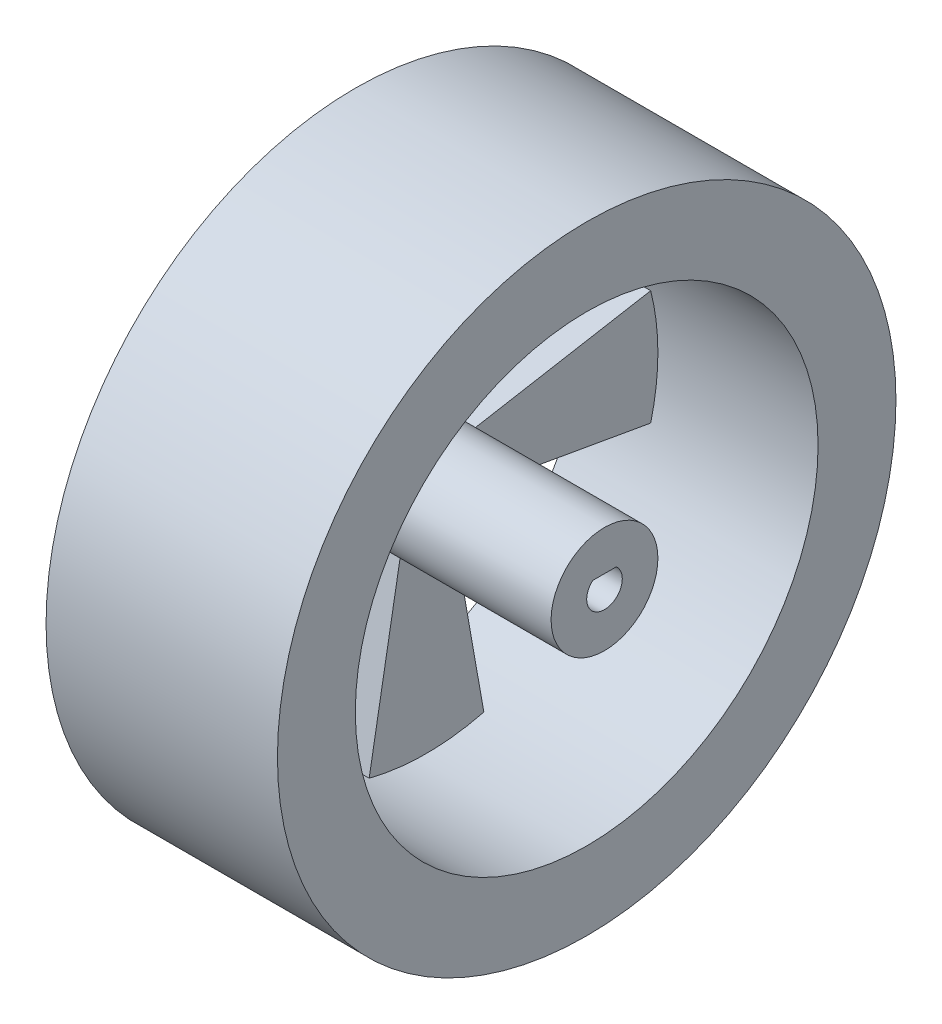
ISO-10303-21;
HEADER;
FILE_DESCRIPTION(('STEP AP214'),'2;1');
FILE_NAME('part.step','',(''),(''),'','','');
FILE_SCHEMA(('AUTOMOTIVE_DESIGN { 1 0 10303 214 1 1 1 1 }'));
ENDSEC;
DATA;
#1=APPLICATION_CONTEXT('core data for automotive mechanical design processes');
#2=APPLICATION_PROTOCOL_DEFINITION('international standard','automotive_design',2000,#1);
#3=PRODUCT_CONTEXT('',#1,'mechanical');
#4=PRODUCT('Part','Part','',(#3));
#5=PRODUCT_RELATED_PRODUCT_CATEGORY('part','',(#4));
#6=PRODUCT_DEFINITION_FORMATION('','',#4);
#7=PRODUCT_DEFINITION_CONTEXT('part definition',#1,'design');
#8=PRODUCT_DEFINITION('design','',#6,#7);
#9=PRODUCT_DEFINITION_SHAPE('','',#8);
#10=(LENGTH_UNIT() NAMED_UNIT(*) SI_UNIT(.MILLI.,.METRE.));
#11=(NAMED_UNIT(*) PLANE_ANGLE_UNIT() SI_UNIT($,.RADIAN.));
#12=(NAMED_UNIT(*) SI_UNIT($,.STERADIAN.) SOLID_ANGLE_UNIT());
#13=UNCERTAINTY_MEASURE_WITH_UNIT(LENGTH_MEASURE(1.E-05),#10,'distance_accuracy_value','');
#14=(GEOMETRIC_REPRESENTATION_CONTEXT(3) GLOBAL_UNCERTAINTY_ASSIGNED_CONTEXT((#13)) GLOBAL_UNIT_ASSIGNED_CONTEXT((#10,
#11,#12)) REPRESENTATION_CONTEXT('',''));
#15=CARTESIAN_POINT('',(0.,0.,0.));
#16=DIRECTION('',(0.,0.,1.));
#17=DIRECTION('',(1.,0.,0.));
#18=AXIS2_PLACEMENT_3D('',#15,#16,#17);
#19=CARTESIAN_POINT('',(8.,0.,0.));
#20=DIRECTION('',(1.,0.,0.));
#21=DIRECTION('',(0.,0.,-1.));
#22=AXIS2_PLACEMENT_3D('',#19,#20,#21);
#23=PLANE('',#22);
#24=DIRECTION('',(0.,0.984807753012209,0.173648177666926));
#25=VECTOR('',#24,1.);
#26=CARTESIAN_POINT('',(8.,-2.42814800674033,-2.42814800674181));
#27=LINE('',#26,#25);
#28=CARTESIAN_POINT('',(8.,-25.1894055583955,-6.44157182795281));
#29=VERTEX_POINT('',#28);
#30=CARTESIAN_POINT('',(8.,-5.23938288019943,-2.92384456404118));
#31=VERTEX_POINT('',#30);
#32=EDGE_CURVE('E242',#29,#31,#27,.T.);
#33=ORIENTED_EDGE('',*,*,#32,.T.);
#34=CARTESIAN_POINT('',(8.,0.,0.));
#35=DIRECTION('',(1.,0.,0.));
#36=DIRECTION('',(0.,0.,-1.));
#37=AXIS2_PLACEMENT_3D('',#34,#35,#36);
#38=CIRCLE('',#37,6.);
#39=CARTESIAN_POINT('',(8.,-5.23938288020022,2.92384456403975));
#40=VERTEX_POINT('',#39);
#41=EDGE_CURVE('E11',#31,#40,#38,.F.);
#42=ORIENTED_EDGE('',*,*,#41,.T.);
#43=DIRECTION('',(0.,-0.984807753012199,0.173648177666982));
#44=VECTOR('',#43,1.);
#45=CARTESIAN_POINT('',(8.,-2.42814800674181,2.42814800674034));
#46=LINE('',#45,#44);
#47=CARTESIAN_POINT('',(8.,-25.1894055583956,6.44157182795243));
#48=VERTEX_POINT('',#47);
#49=EDGE_CURVE('E233',#40,#48,#46,.T.);
#50=ORIENTED_EDGE('',*,*,#49,.T.);
#51=CARTESIAN_POINT('',(8.,0.,0.));
#52=DIRECTION('',(1.,0.,0.));
#53=DIRECTION('',(0.,0.,-1.));
#54=AXIS2_PLACEMENT_3D('',#51,#52,#53);
#55=CIRCLE('',#54,26.);
#56=EDGE_CURVE('E237',#48,#29,#55,.T.);
#57=ORIENTED_EDGE('',*,*,#56,.T.);
#58=EDGE_LOOP('',(#33,#42,#50,#57));
#59=FACE_BOUND('',#58,.T.);
#60=ADVANCED_FACE('F40',(#59),#23,.T.);
#61=DIRECTION('',(0.,0.173648177666922,-0.98480775301221));
#62=VECTOR('',#61,1.);
#63=CARTESIAN_POINT('',(8.,-2.42814800674181,2.42814800674034));
#64=LINE('',#63,#62);
#65=CARTESIAN_POINT('',(8.,-6.44157182795271,25.1894055583955));
#66=VERTEX_POINT('',#65);
#67=CARTESIAN_POINT('',(8.,-2.92384456404117,5.23938288019943));
#68=VERTEX_POINT('',#67);
#69=EDGE_CURVE('E229',#66,#68,#64,.T.);
#70=ORIENTED_EDGE('',*,*,#69,.T.);
#71=CARTESIAN_POINT('',(8.,2.92384456403975,5.23938288020022));
#72=VERTEX_POINT('',#71);
#73=EDGE_CURVE('E50',#68,#72,#38,.F.);
#74=ORIENTED_EDGE('',*,*,#73,.T.);
#75=DIRECTION('',(0.,0.173648177666982,0.984807753012199));
#76=VECTOR('',#75,1.);
#77=CARTESIAN_POINT('',(8.,2.42814800674034,2.42814800674181));
#78=LINE('',#77,#76);
#79=CARTESIAN_POINT('',(8.,6.44157182795243,25.1894055583956));
#80=VERTEX_POINT('',#79);
#81=EDGE_CURVE('E220',#72,#80,#78,.T.);
#82=ORIENTED_EDGE('',*,*,#81,.T.);
#83=CARTESIAN_POINT('',(8.,0.,0.));
#84=DIRECTION('',(1.,0.,0.));
#85=DIRECTION('',(0.,0.,-1.));
#86=AXIS2_PLACEMENT_3D('',#83,#84,#85);
#87=CIRCLE('',#86,26.);
#88=EDGE_CURVE('E224',#80,#66,#87,.T.);
#89=ORIENTED_EDGE('',*,*,#88,.T.);
#90=EDGE_LOOP('',(#70,#74,#82,#89));
#91=FACE_BOUND('',#90,.T.);
#92=ADVANCED_FACE('F439',(#91),#23,.T.);
#93=DIRECTION('',(0.,-0.984807753012212,-0.17364817766691));
#94=VECTOR('',#93,1.);
#95=CARTESIAN_POINT('',(8.,2.42814800674034,2.42814800674181));
#96=LINE('',#95,#94);
#97=CARTESIAN_POINT('',(8.,25.1894055583956,6.44157182795243));
#98=VERTEX_POINT('',#97);
#99=CARTESIAN_POINT('',(8.,5.23938288019945,2.92384456404114));
#100=VERTEX_POINT('',#99);
#101=EDGE_CURVE('E216',#98,#100,#96,.T.);
#102=ORIENTED_EDGE('',*,*,#101,.T.);
#103=CARTESIAN_POINT('',(8.,5.23938288020019,-2.92384456403982));
#104=VERTEX_POINT('',#103);
#105=EDGE_CURVE('E451',#100,#104,#38,.F.);
#106=ORIENTED_EDGE('',*,*,#105,.T.);
#107=DIRECTION('',(0.,0.984807753012195,-0.173648177667007));
#108=VECTOR('',#107,1.);
#109=CARTESIAN_POINT('',(8.,2.42814800674181,-2.42814800674034));
#110=LINE('',#109,#108);
#111=CARTESIAN_POINT('',(8.,25.1894055583954,-6.44157182795298));
#112=VERTEX_POINT('',#111);
#113=EDGE_CURVE('E207',#104,#112,#110,.T.);
#114=ORIENTED_EDGE('',*,*,#113,.T.);
#115=CARTESIAN_POINT('',(8.,0.,0.));
#116=DIRECTION('',(1.,0.,0.));
#117=DIRECTION('',(0.,0.,-1.));
#118=AXIS2_PLACEMENT_3D('',#115,#116,#117);
#119=CIRCLE('',#118,26.);
#120=EDGE_CURVE('E211',#112,#98,#119,.T.);
#121=ORIENTED_EDGE('',*,*,#120,.T.);
#122=EDGE_LOOP('',(#102,#106,#114,#121));
#123=FACE_BOUND('',#122,.T.);
#124=ADVANCED_FACE('F368',(#123),#23,.T.);
#125=CARTESIAN_POINT('',(26.,0.,0.));
#126=DIRECTION('',(-1.,0.,0.));
#127=DIRECTION('',(0.,0.,1.));
#128=AXIS2_PLACEMENT_3D('',#125,#126,#127);
#129=CYLINDRICAL_SURFACE('',#128,26.);
#130=CARTESIAN_POINT('',(26.,0.,0.));
#131=DIRECTION('',(1.,0.,0.));
#132=DIRECTION('',(0.,0.,-1.));
#133=AXIS2_PLACEMENT_3D('',#130,#131,#132);
#134=CIRCLE('',#133,26.);
#135=CARTESIAN_POINT('',(26.,0.,-26.));
#136=VERTEX_POINT('',#135);
#137=EDGE_CURVE('E343',#136,#136,#134,.T.);
#138=ORIENTED_EDGE('',*,*,#137,.T.);
#139=EDGE_LOOP('',(#138));
#140=FACE_BOUND('',#139,.T.);
#141=CARTESIAN_POINT('',(0.,0.,0.));
#142=DIRECTION('',(1.,0.,0.));
#143=DIRECTION('',(0.,0.,-1.));
#144=AXIS2_PLACEMENT_3D('',#141,#142,#143);
#145=CIRCLE('',#144,26.);
#146=CARTESIAN_POINT('',(0.,0.,-26.));
#147=VERTEX_POINT('',#146);
#148=EDGE_CURVE('E302',#147,#147,#145,.T.);
#149=ORIENTED_EDGE('',*,*,#148,.F.);
#150=EDGE_LOOP('',(#149));
#151=FACE_BOUND('',#150,.T.);
#152=DIRECTION('',(1.,0.,0.));
#153=VECTOR('',#152,1.);
#154=CARTESIAN_POINT('',(2.,-6.44157182795243,-25.1894055583956));
#155=LINE('',#154,#153);
#156=CARTESIAN_POINT('',(2.,-6.44157182795243,-25.1894055583956));
#157=VERTEX_POINT('',#156);
#158=CARTESIAN_POINT('',(8.,-6.44157182795243,-25.1894055583956));
#159=VERTEX_POINT('',#158);
#160=EDGE_CURVE('E303',#157,#159,#155,.T.);
#161=ORIENTED_EDGE('',*,*,#160,.F.);
#162=CARTESIAN_POINT('',(2.,0.,0.));
#163=DIRECTION('',(1.,0.,0.));
#164=DIRECTION('',(0.,0.,-1.));
#165=AXIS2_PLACEMENT_3D('',#162,#163,#164);
#166=CIRCLE('',#165,26.);
#167=CARTESIAN_POINT('',(2.,6.44157182795289,-25.1894055583954));
#168=VERTEX_POINT('',#167);
#169=EDGE_CURVE('E295',#157,#168,#166,.T.);
#170=ORIENTED_EDGE('',*,*,#169,.T.);
#171=DIRECTION('',(1.,0.,0.));
#172=VECTOR('',#171,1.);
#173=CARTESIAN_POINT('',(2.,6.44157182795291,-25.1894055583954));
#174=LINE('',#173,#172);
#175=CARTESIAN_POINT('',(8.,6.44157182795291,-25.1894055583954));
#176=VERTEX_POINT('',#175);
#177=EDGE_CURVE('E299',#168,#176,#174,.T.);
#178=ORIENTED_EDGE('',*,*,#177,.T.);
#179=CARTESIAN_POINT('',(8.,0.,0.));
#180=DIRECTION('',(1.,0.,0.));
#181=DIRECTION('',(0.,0.,-1.));
#182=AXIS2_PLACEMENT_3D('',#179,#180,#181);
#183=CIRCLE('',#182,26.);
#184=EDGE_CURVE('E250',#159,#176,#183,.T.);
#185=ORIENTED_EDGE('',*,*,#184,.F.);
#186=EDGE_LOOP('',(#161,#170,#178,#185));
#187=FACE_BOUND('',#186,.T.);
#188=DIRECTION('',(1.,0.,0.));
#189=VECTOR('',#188,1.);
#190=CARTESIAN_POINT('',(2.,-25.1894055583956,6.44157182795243));
#191=LINE('',#190,#189);
#192=CARTESIAN_POINT('',(2.,-25.1894055583956,6.44157182795243));
#193=VERTEX_POINT('',#192);
#194=EDGE_CURVE('E314',#193,#48,#191,.T.);
#195=ORIENTED_EDGE('',*,*,#194,.F.);
#196=CARTESIAN_POINT('',(2.,0.,0.));
#197=DIRECTION('',(1.,0.,0.));
#198=DIRECTION('',(0.,0.,-1.));
#199=AXIS2_PLACEMENT_3D('',#196,#197,#198);
#200=CIRCLE('',#199,26.);
#201=CARTESIAN_POINT('',(2.,-25.1894055583955,-6.44157182795281));
#202=VERTEX_POINT('',#201);
#203=EDGE_CURVE('E284',#193,#202,#200,.T.);
#204=ORIENTED_EDGE('',*,*,#203,.T.);
#205=DIRECTION('',(1.,0.,0.));
#206=VECTOR('',#205,1.);
#207=CARTESIAN_POINT('',(2.,-25.1894055583955,-6.44157182795281));
#208=LINE('',#207,#206);
#209=EDGE_CURVE('E311',#202,#29,#208,.T.);
#210=ORIENTED_EDGE('',*,*,#209,.T.);
#211=ORIENTED_EDGE('',*,*,#56,.F.);
#212=EDGE_LOOP('',(#195,#204,#210,#211));
#213=FACE_BOUND('',#212,.T.);
#214=DIRECTION('',(1.,0.,0.));
#215=VECTOR('',#214,1.);
#216=CARTESIAN_POINT('',(2.,6.44157182795243,25.1894055583956));
#217=LINE('',#216,#215);
#218=CARTESIAN_POINT('',(2.,6.44157182795243,25.1894055583956));
#219=VERTEX_POINT('',#218);
#220=EDGE_CURVE('E325',#219,#80,#217,.T.);
#221=ORIENTED_EDGE('',*,*,#220,.F.);
#222=CARTESIAN_POINT('',(2.,0.,0.));
#223=DIRECTION('',(1.,0.,0.));
#224=DIRECTION('',(0.,0.,-1.));
#225=AXIS2_PLACEMENT_3D('',#222,#223,#224);
#226=CIRCLE('',#225,26.);
#227=CARTESIAN_POINT('',(2.,-6.44157182795271,25.1894055583955));
#228=VERTEX_POINT('',#227);
#229=EDGE_CURVE('E273',#219,#228,#226,.T.);
#230=ORIENTED_EDGE('',*,*,#229,.T.);
#231=DIRECTION('',(1.,0.,0.));
#232=VECTOR('',#231,1.);
#233=CARTESIAN_POINT('',(2.,-6.44157182795271,25.1894055583955));
#234=LINE('',#233,#232);
#235=EDGE_CURVE('E322',#228,#66,#234,.T.);
#236=ORIENTED_EDGE('',*,*,#235,.T.);
#237=ORIENTED_EDGE('',*,*,#88,.F.);
#238=EDGE_LOOP('',(#221,#230,#236,#237));
#239=FACE_BOUND('',#238,.T.);
#240=DIRECTION('',(1.,0.,0.));
#241=VECTOR('',#240,1.);
#242=CARTESIAN_POINT('',(2.,25.1894055583954,-6.44157182795298));
#243=LINE('',#242,#241);
#244=CARTESIAN_POINT('',(2.,25.1894055583954,-6.44157182795298));
#245=VERTEX_POINT('',#244);
#246=EDGE_CURVE('E336',#245,#112,#243,.T.);
#247=ORIENTED_EDGE('',*,*,#246,.F.);
#248=CARTESIAN_POINT('',(2.,0.,0.));
#249=DIRECTION('',(1.,0.,0.));
#250=DIRECTION('',(0.,0.,-1.));
#251=AXIS2_PLACEMENT_3D('',#248,#249,#250);
#252=CIRCLE('',#251,26.);
#253=CARTESIAN_POINT('',(2.,25.1894055583956,6.44157182795243));
#254=VERTEX_POINT('',#253);
#255=EDGE_CURVE('E262',#245,#254,#252,.T.);
#256=ORIENTED_EDGE('',*,*,#255,.T.);
#257=DIRECTION('',(1.,0.,0.));
#258=VECTOR('',#257,1.);
#259=CARTESIAN_POINT('',(2.,25.1894055583956,6.44157182795243));
#260=LINE('',#259,#258);
#261=EDGE_CURVE('E333',#254,#98,#260,.T.);
#262=ORIENTED_EDGE('',*,*,#261,.T.);
#263=ORIENTED_EDGE('',*,*,#120,.F.);
#264=EDGE_LOOP('',(#247,#256,#262,#263));
#265=FACE_BOUND('',#264,.T.);
#266=ADVANCED_FACE('F365',(#140,#151,#187,#213,#239,#265),#129,.F.);
#267=CARTESIAN_POINT('',(26.,0.,0.));
#268=DIRECTION('',(1.,0.,0.));
#269=DIRECTION('',(0.,0.,-1.));
#270=AXIS2_PLACEMENT_3D('',#267,#268,#269);
#271=PLANE('',#270);
#272=CARTESIAN_POINT('',(26.,0.,0.));
#273=DIRECTION('',(1.,0.,0.));
#274=DIRECTION('',(0.,0.,-1.));
#275=AXIS2_PLACEMENT_3D('',#272,#273,#274);
#276=CIRCLE('',#275,34.75);
#277=CARTESIAN_POINT('',(26.,0.,34.75));
#278=VERTEX_POINT('',#277);
#279=EDGE_CURVE('E351',#278,#278,#276,.T.);
#280=ORIENTED_EDGE('',*,*,#279,.T.);
#281=EDGE_LOOP('',(#280));
#282=FACE_BOUND('',#281,.T.);
#283=ORIENTED_EDGE('',*,*,#137,.F.);
#284=EDGE_LOOP('',(#283));
#285=FACE_BOUND('',#284,.T.);
#286=ADVANCED_FACE('F362',(#282,#285),#271,.T.);
#287=CARTESIAN_POINT('',(0.,0.,0.));
#288=DIRECTION('',(1.,0.,0.));
#289=DIRECTION('',(0.,0.,-1.));
#290=AXIS2_PLACEMENT_3D('',#287,#288,#289);
#291=PLANE('',#290);
#292=CARTESIAN_POINT('',(0.,0.,0.));
#293=DIRECTION('',(1.,0.,0.));
#294=DIRECTION('',(0.,0.,-1.));
#295=AXIS2_PLACEMENT_3D('',#292,#293,#294);
#296=CIRCLE('',#295,34.75);
#297=CARTESIAN_POINT('',(0.,0.,34.75));
#298=VERTEX_POINT('',#297);
#299=EDGE_CURVE('E347',#298,#298,#296,.T.);
#300=ORIENTED_EDGE('',*,*,#299,.F.);
#301=EDGE_LOOP('',(#300));
#302=FACE_BOUND('',#301,.T.);
#303=ORIENTED_EDGE('',*,*,#148,.T.);
#304=EDGE_LOOP('',(#303));
#305=FACE_BOUND('',#304,.T.);
#306=ADVANCED_FACE('F359',(#302,#305),#291,.F.);
#307=CARTESIAN_POINT('',(26.,0.,0.));
#308=DIRECTION('',(-1.,0.,0.));
#309=DIRECTION('',(0.,0.,1.));
#310=AXIS2_PLACEMENT_3D('',#307,#308,#309);
#311=CYLINDRICAL_SURFACE('',#310,34.75);
#312=CARTESIAN_POINT('',(26.,0.,34.75));
#313=CARTESIAN_POINT('',(25.7291666666667,0.,34.75));
#314=CARTESIAN_POINT('',(25.4583333333333,0.,34.75));
#315=CARTESIAN_POINT('',(24.9166666666667,0.,34.75));
#316=CARTESIAN_POINT('',(24.6458333333333,0.,34.75));
#317=CARTESIAN_POINT('',(24.1041666666667,0.,34.75));
#318=CARTESIAN_POINT('',(23.8333333333333,0.,34.75));
#319=CARTESIAN_POINT('',(23.2916666666667,0.,34.75));
#320=CARTESIAN_POINT('',(23.0208333333333,0.,34.75));
#321=CARTESIAN_POINT('',(22.4791666666667,0.,34.75));
#322=CARTESIAN_POINT('',(22.2083333333333,0.,34.75));
#323=CARTESIAN_POINT('',(21.6666666666667,0.,34.75));
#324=CARTESIAN_POINT('',(21.3958333333333,0.,34.75));
#325=CARTESIAN_POINT('',(20.8541666666667,0.,34.75));
#326=CARTESIAN_POINT('',(20.5833333333333,0.,34.75));
#327=CARTESIAN_POINT('',(20.0416666666667,0.,34.75));
#328=CARTESIAN_POINT('',(19.7708333333333,0.,34.75));
#329=CARTESIAN_POINT('',(19.2291666666667,0.,34.75));
#330=CARTESIAN_POINT('',(18.9583333333333,0.,34.75));
#331=CARTESIAN_POINT('',(18.4166666666667,0.,34.75));
#332=CARTESIAN_POINT('',(18.1458333333333,0.,34.75));
#333=CARTESIAN_POINT('',(17.6041666666667,0.,34.75));
#334=CARTESIAN_POINT('',(17.3333333333333,0.,34.75));
#335=CARTESIAN_POINT('',(16.7916666666667,0.,34.75));
#336=CARTESIAN_POINT('',(16.5208333333333,0.,34.75));
#337=CARTESIAN_POINT('',(15.9791666666667,0.,34.75));
#338=CARTESIAN_POINT('',(15.7083333333333,0.,34.75));
#339=CARTESIAN_POINT('',(15.1666666666667,0.,34.75));
#340=CARTESIAN_POINT('',(14.8958333333333,0.,34.75));
#341=CARTESIAN_POINT('',(14.3541666666667,0.,34.75));
#342=CARTESIAN_POINT('',(14.0833333333333,0.,34.75));
#343=CARTESIAN_POINT('',(13.5416666666667,0.,34.75));
#344=CARTESIAN_POINT('',(13.2708333333333,0.,34.75));
#345=CARTESIAN_POINT('',(12.7291666666667,0.,34.75));
#346=CARTESIAN_POINT('',(12.4583333333333,0.,34.75));
#347=CARTESIAN_POINT('',(11.9166666666667,0.,34.75));
#348=CARTESIAN_POINT('',(11.6458333333333,0.,34.75));
#349=CARTESIAN_POINT('',(11.1041666666667,0.,34.75));
#350=CARTESIAN_POINT('',(10.8333333333333,0.,34.75));
#351=CARTESIAN_POINT('',(10.2916666666667,0.,34.75));
#352=CARTESIAN_POINT('',(10.0208333333333,0.,34.75));
#353=CARTESIAN_POINT('',(9.47916666666667,0.,34.75));
#354=CARTESIAN_POINT('',(9.20833333333333,0.,34.75));
#355=CARTESIAN_POINT('',(8.66666666666667,0.,34.75));
#356=CARTESIAN_POINT('',(8.39583333333333,0.,34.75));
#357=CARTESIAN_POINT('',(7.85416666666667,0.,34.75));
#358=CARTESIAN_POINT('',(7.58333333333333,0.,34.75));
#359=CARTESIAN_POINT('',(7.04166666666667,0.,34.75));
#360=CARTESIAN_POINT('',(6.77083333333333,0.,34.75));
#361=CARTESIAN_POINT('',(6.22916666666667,0.,34.75));
#362=CARTESIAN_POINT('',(5.95833333333333,0.,34.75));
#363=CARTESIAN_POINT('',(5.41666666666667,0.,34.75));
#364=CARTESIAN_POINT('',(5.14583333333333,0.,34.75));
#365=CARTESIAN_POINT('',(4.60416666666667,0.,34.75));
#366=CARTESIAN_POINT('',(4.33333333333333,0.,34.75));
#367=CARTESIAN_POINT('',(3.79166666666667,0.,34.75));
#368=CARTESIAN_POINT('',(3.52083333333333,0.,34.75));
#369=CARTESIAN_POINT('',(2.97916666666667,0.,34.75));
#370=CARTESIAN_POINT('',(2.70833333333333,0.,34.75));
#371=CARTESIAN_POINT('',(2.16666666666667,0.,34.75));
#372=CARTESIAN_POINT('',(1.89583333333333,0.,34.75));
#373=CARTESIAN_POINT('',(1.35416666666667,0.,34.75));
#374=CARTESIAN_POINT('',(1.08333333333333,0.,34.75));
#375=CARTESIAN_POINT('',(0.541666666666667,0.,34.75));
#376=CARTESIAN_POINT('',(0.270833333333334,0.,34.75));
#377=CARTESIAN_POINT('',(0.,0.,34.75));
#378=B_SPLINE_CURVE_WITH_KNOTS('',3,(#312,#313,#314,#315,#316,#317,#318,#319,#320,#321,#322,
#323,#324,#325,#326,#327,#328,#329,#330,#331,#332,#333,#334,#335,#336,#337,#338,#339,#340,#341,
#342,#343,#344,#345,#346,#347,#348,#349,#350,#351,#352,#353,#354,#355,#356,#357,#358,#359,#360,
#361,#362,#363,#364,#365,#366,#367,#368,#369,#370,#371,#372,#373,#374,#375,#376,#377),
.UNSPECIFIED.,.F.,.F.,(4,2,2,2,2,2,2,2,2,2,2,2,2,2,2,2,2,2,2,2,2,2,2,2,2,2,2,2,2,2,2,2,4),(0.,
0.812499999999997,1.625,2.4375,3.25,4.0625,4.875,5.6875,6.5,7.3125,8.125,8.93749999999999,
9.74999999999999,10.5625,11.375,12.1875,13.,13.8125,14.625,15.4375,16.25,17.0625,17.875,18.6875,
19.5,20.3125,21.125,21.9375,22.75,23.5625,24.375,25.1875,26.),.UNSPECIFIED.);
#379=EDGE_CURVE('BSEAM42',#278,#298,#378,.T.);
#380=ORIENTED_EDGE('',*,*,#279,.F.);
#381=ORIENTED_EDGE('',*,*,#299,.T.);
#382=ORIENTED_EDGE('',*,*,#379,.T.);
#383=ORIENTED_EDGE('',*,*,#379,.F.);
#384=EDGE_LOOP('',(#380,#382,#381,#383));
#385=FACE_BOUND('',#384,.T.);
#386=ADVANCED_FACE('F42',(#385),#311,.T.);
#387=CARTESIAN_POINT('',(2.,2.42814800674181,-2.42814800674034));
#388=DIRECTION('',(0.,0.984807753012208,0.17364817766693));
#389=DIRECTION('',(0.,-0.17364817766693,0.984807753012208));
#390=AXIS2_PLACEMENT_3D('',#387,#388,#389);
#391=PLANE('',#390);
#392=DIRECTION('',(1.,0.,0.));
#393=VECTOR('',#392,1.);
#394=CARTESIAN_POINT('',(2.,2.42814800674181,-2.42814800674034));
#395=LINE('',#394,#393);
#396=CARTESIAN_POINT('',(2.,2.42814800674181,-2.42814800674034));
#397=VERTEX_POINT('',#396);
#398=CARTESIAN_POINT('',(8.,2.42814800674181,-2.42814800674034));
#399=VERTEX_POINT('',#398);
#400=EDGE_CURVE('E298',#397,#399,#395,.T.);
#401=ORIENTED_EDGE('',*,*,#400,.T.);
#402=DIRECTION('',(0.,-0.17364817766693,0.984807753012208));
#403=VECTOR('',#402,1.);
#404=CARTESIAN_POINT('',(8.,2.42814800674181,-2.42814800674034));
#405=LINE('',#404,#403);
#406=CARTESIAN_POINT('',(8.,2.92384456404119,-5.23938288019942));
#407=VERTEX_POINT('',#406);
#408=EDGE_CURVE('E197',#407,#399,#405,.T.);
#409=ORIENTED_EDGE('',*,*,#408,.F.);
#410=EDGE_CURVE('E203',#176,#407,#405,.T.);
#411=ORIENTED_EDGE('',*,*,#410,.F.);
#412=ORIENTED_EDGE('',*,*,#177,.F.);
#413=DIRECTION('',(0.,-0.17364817766693,0.984807753012208));
#414=VECTOR('',#413,1.);
#415=CARTESIAN_POINT('',(2.,2.42814800674181,-2.42814800674034));
#416=LINE('',#415,#414);
#417=EDGE_CURVE('E254',#168,#397,#416,.T.);
#418=ORIENTED_EDGE('',*,*,#417,.T.);
#419=EDGE_LOOP('',(#401,#409,#411,#412,#418));
#420=FACE_BOUND('',#419,.T.);
#421=ADVANCED_FACE('F394',(#420),#391,.T.);
#422=CARTESIAN_POINT('',(2.,-2.42814800674033,-2.42814800674181));
#423=DIRECTION('',(0.,-0.984807753012199,0.173648177666982));
#424=DIRECTION('',(0.,-0.173648177666982,-0.984807753012199));
#425=AXIS2_PLACEMENT_3D('',#422,#423,#424);
#426=PLANE('',#425);
#427=ORIENTED_EDGE('',*,*,#160,.T.);
#428=DIRECTION('',(0.,-0.173648177666982,-0.984807753012199));
#429=VECTOR('',#428,1.);
#430=CARTESIAN_POINT('',(8.,-2.42814800674033,-2.42814800674181));
#431=LINE('',#430,#429);
#432=CARTESIAN_POINT('',(8.,-2.92384456403975,-5.23938288020022));
#433=VERTEX_POINT('',#432);
#434=EDGE_CURVE('E246',#433,#159,#431,.T.);
#435=ORIENTED_EDGE('',*,*,#434,.F.);
#436=CARTESIAN_POINT('',(8.,-2.42814800674033,-2.42814800674181));
#437=VERTEX_POINT('',#436);
#438=EDGE_CURVE('E247',#437,#433,#431,.T.);
#439=ORIENTED_EDGE('',*,*,#438,.F.);
#440=DIRECTION('',(1.,0.,0.));
#441=VECTOR('',#440,1.);
#442=CARTESIAN_POINT('',(2.,-2.42814800674033,-2.42814800674181));
#443=LINE('',#442,#441);
#444=CARTESIAN_POINT('',(2.,-2.42814800674033,-2.42814800674181));
#445=VERTEX_POINT('',#444);
#446=EDGE_CURVE('E307',#445,#437,#443,.T.);
#447=ORIENTED_EDGE('',*,*,#446,.F.);
#448=DIRECTION('',(0.,-0.173648177666982,-0.984807753012199));
#449=VECTOR('',#448,1.);
#450=CARTESIAN_POINT('',(2.,-2.42814800674033,-2.42814800674181));
#451=LINE('',#450,#449);
#452=EDGE_CURVE('E291',#445,#157,#451,.T.);
#453=ORIENTED_EDGE('',*,*,#452,.T.);
#454=EDGE_LOOP('',(#427,#435,#439,#447,#453));
#455=FACE_BOUND('',#454,.T.);
#456=ADVANCED_FACE('F518',(#455),#426,.T.);
#457=CARTESIAN_POINT('',(2.,-2.42814800674033,-2.42814800674181));
#458=DIRECTION('',(0.,0.173648177666926,-0.984807753012209));
#459=DIRECTION('',(0.,0.984807753012209,0.173648177666926));
#460=AXIS2_PLACEMENT_3D('',#457,#458,#459);
#461=PLANE('',#460);
#462=ORIENTED_EDGE('',*,*,#446,.T.);
#463=EDGE_CURVE('E241',#31,#437,#27,.T.);
#464=ORIENTED_EDGE('',*,*,#463,.F.);
#465=ORIENTED_EDGE('',*,*,#32,.F.);
#466=ORIENTED_EDGE('',*,*,#209,.F.);
#467=DIRECTION('',(0.,0.984807753012209,0.173648177666926));
#468=VECTOR('',#467,1.);
#469=CARTESIAN_POINT('',(2.,-2.42814800674033,-2.42814800674181));
#470=LINE('',#469,#468);
#471=EDGE_CURVE('E287',#202,#445,#470,.T.);
#472=ORIENTED_EDGE('',*,*,#471,.T.);
#473=EDGE_LOOP('',(#462,#464,#465,#466,#472));
#474=FACE_BOUND('',#473,.T.);
#475=ADVANCED_FACE('F525',(#474),#461,.T.);
#476=CARTESIAN_POINT('',(2.,-2.42814800674181,2.42814800674034));
#477=DIRECTION('',(0.,0.173648177666982,0.984807753012199));
#478=DIRECTION('',(0.,-0.984807753012199,0.173648177666982));
#479=AXIS2_PLACEMENT_3D('',#476,#477,#478);
#480=PLANE('',#479);
#481=ORIENTED_EDGE('',*,*,#194,.T.);
#482=ORIENTED_EDGE('',*,*,#49,.F.);
#483=CARTESIAN_POINT('',(8.,-2.42814800674181,2.42814800674034));
#484=VERTEX_POINT('',#483);
#485=EDGE_CURVE('E234',#484,#40,#46,.T.);
#486=ORIENTED_EDGE('',*,*,#485,.F.);
#487=DIRECTION('',(1.,0.,0.));
#488=VECTOR('',#487,1.);
#489=CARTESIAN_POINT('',(2.,-2.42814800674181,2.42814800674034));
#490=LINE('',#489,#488);
#491=CARTESIAN_POINT('',(2.,-2.42814800674181,2.42814800674034));
#492=VERTEX_POINT('',#491);
#493=EDGE_CURVE('E318',#492,#484,#490,.T.);
#494=ORIENTED_EDGE('',*,*,#493,.F.);
#495=DIRECTION('',(0.,-0.984807753012199,0.173648177666982));
#496=VECTOR('',#495,1.);
#497=CARTESIAN_POINT('',(2.,-2.42814800674181,2.42814800674034));
#498=LINE('',#497,#496);
#499=EDGE_CURVE('E280',#492,#193,#498,.T.);
#500=ORIENTED_EDGE('',*,*,#499,.T.);
#501=EDGE_LOOP('',(#481,#482,#486,#494,#500));
#502=FACE_BOUND('',#501,.T.);
#503=ADVANCED_FACE('F431',(#502),#480,.T.);
#504=CARTESIAN_POINT('',(2.,-2.42814800674181,2.42814800674034));
#505=DIRECTION('',(0.,-0.984807753012209,-0.173648177666922));
#506=DIRECTION('',(0.,0.173648177666922,-0.98480775301221));
#507=AXIS2_PLACEMENT_3D('',#504,#505,#506);
#508=PLANE('',#507);
#509=ORIENTED_EDGE('',*,*,#493,.T.);
#510=EDGE_CURVE('E228',#68,#484,#64,.T.);
#511=ORIENTED_EDGE('',*,*,#510,.F.);
#512=ORIENTED_EDGE('',*,*,#69,.F.);
#513=ORIENTED_EDGE('',*,*,#235,.F.);
#514=DIRECTION('',(0.,0.173648177666922,-0.98480775301221));
#515=VECTOR('',#514,1.);
#516=CARTESIAN_POINT('',(2.,-2.42814800674181,2.42814800674034));
#517=LINE('',#516,#515);
#518=EDGE_CURVE('E276',#228,#492,#517,.T.);
#519=ORIENTED_EDGE('',*,*,#518,.T.);
#520=EDGE_LOOP('',(#509,#511,#512,#513,#519));
#521=FACE_BOUND('',#520,.T.);
#522=ADVANCED_FACE('F436',(#521),#508,.T.);
#523=CARTESIAN_POINT('',(2.,2.42814800674034,2.42814800674181));
#524=DIRECTION('',(0.,0.984807753012199,-0.173648177666982));
#525=DIRECTION('',(0.,0.173648177666982,0.984807753012199));
#526=AXIS2_PLACEMENT_3D('',#523,#524,#525);
#527=PLANE('',#526);
#528=ORIENTED_EDGE('',*,*,#220,.T.);
#529=ORIENTED_EDGE('',*,*,#81,.F.);
#530=CARTESIAN_POINT('',(8.,2.42814800674034,2.42814800674181));
#531=VERTEX_POINT('',#530);
#532=EDGE_CURVE('E221',#531,#72,#78,.T.);
#533=ORIENTED_EDGE('',*,*,#532,.F.);
#534=DIRECTION('',(1.,0.,0.));
#535=VECTOR('',#534,1.);
#536=CARTESIAN_POINT('',(2.,2.42814800674034,2.42814800674181));
#537=LINE('',#536,#535);
#538=CARTESIAN_POINT('',(2.,2.42814800674034,2.42814800674181));
#539=VERTEX_POINT('',#538);
#540=EDGE_CURVE('E329',#539,#531,#537,.T.);
#541=ORIENTED_EDGE('',*,*,#540,.F.);
#542=DIRECTION('',(0.,0.173648177666982,0.984807753012199));
#543=VECTOR('',#542,1.);
#544=CARTESIAN_POINT('',(2.,2.42814800674034,2.42814800674181));
#545=LINE('',#544,#543);
#546=EDGE_CURVE('E269',#539,#219,#545,.T.);
#547=ORIENTED_EDGE('',*,*,#546,.T.);
#548=EDGE_LOOP('',(#528,#529,#533,#541,#547));
#549=FACE_BOUND('',#548,.T.);
#550=ADVANCED_FACE('F443',(#549),#527,.T.);
#551=CARTESIAN_POINT('',(2.,2.42814800674034,2.42814800674181));
#552=DIRECTION('',(0.,-0.17364817766691,0.984807753012212));
#553=DIRECTION('',(0.,-0.984807753012212,-0.17364817766691));
#554=AXIS2_PLACEMENT_3D('',#551,#552,#553);
#555=PLANE('',#554);
#556=ORIENTED_EDGE('',*,*,#540,.T.);
#557=EDGE_CURVE('E215',#100,#531,#96,.T.);
#558=ORIENTED_EDGE('',*,*,#557,.F.);
#559=ORIENTED_EDGE('',*,*,#101,.F.);
#560=ORIENTED_EDGE('',*,*,#261,.F.);
#561=DIRECTION('',(0.,-0.984807753012212,-0.17364817766691));
#562=VECTOR('',#561,1.);
#563=CARTESIAN_POINT('',(2.,2.42814800674034,2.42814800674181));
#564=LINE('',#563,#562);
#565=EDGE_CURVE('E265',#254,#539,#564,.T.);
#566=ORIENTED_EDGE('',*,*,#565,.T.);
#567=EDGE_LOOP('',(#556,#558,#559,#560,#566));
#568=FACE_BOUND('',#567,.T.);
#569=ADVANCED_FACE('F445',(#568),#555,.T.);
#570=CARTESIAN_POINT('',(2.,2.42814800674181,-2.42814800674034));
#571=DIRECTION('',(0.,-0.173648177667007,-0.984807753012194));
#572=DIRECTION('',(0.,0.984807753012195,-0.173648177667007));
#573=AXIS2_PLACEMENT_3D('',#570,#571,#572);
#574=PLANE('',#573);
#575=ORIENTED_EDGE('',*,*,#246,.T.);
#576=ORIENTED_EDGE('',*,*,#113,.F.);
#577=EDGE_CURVE('E208',#399,#104,#110,.T.);
#578=ORIENTED_EDGE('',*,*,#577,.F.);
#579=ORIENTED_EDGE('',*,*,#400,.F.);
#580=DIRECTION('',(0.,0.984807753012195,-0.173648177667007));
#581=VECTOR('',#580,1.);
#582=CARTESIAN_POINT('',(2.,2.42814800674181,-2.42814800674034));
#583=LINE('',#582,#581);
#584=EDGE_CURVE('E258',#397,#245,#583,.T.);
#585=ORIENTED_EDGE('',*,*,#584,.T.);
#586=EDGE_LOOP('',(#575,#576,#578,#579,#585));
#587=FACE_BOUND('',#586,.T.);
#588=ADVANCED_FACE('F390',(#587),#574,.T.);
#589=CARTESIAN_POINT('',(2.,0.,0.));
#590=DIRECTION('',(1.,0.,0.));
#591=DIRECTION('',(0.,0.,-1.));
#592=AXIS2_PLACEMENT_3D('',#589,#590,#591);
#593=PLANE('',#592);
#594=ORIENTED_EDGE('',*,*,#417,.F.);
#595=ORIENTED_EDGE('',*,*,#169,.F.);
#596=ORIENTED_EDGE('',*,*,#452,.F.);
#597=ORIENTED_EDGE('',*,*,#471,.F.);
#598=ORIENTED_EDGE('',*,*,#203,.F.);
#599=ORIENTED_EDGE('',*,*,#499,.F.);
#600=ORIENTED_EDGE('',*,*,#518,.F.);
#601=ORIENTED_EDGE('',*,*,#229,.F.);
#602=ORIENTED_EDGE('',*,*,#546,.F.);
#603=ORIENTED_EDGE('',*,*,#565,.F.);
#604=ORIENTED_EDGE('',*,*,#255,.F.);
#605=ORIENTED_EDGE('',*,*,#584,.F.);
#606=EDGE_LOOP('',(#594,#595,#596,#597,#598,#599,#600,#601,#602,#603,#604,#605));
#607=FACE_BOUND('',#606,.T.);
#608=ADVANCED_FACE('F388',(#607),#593,.F.);
#609=ORIENTED_EDGE('',*,*,#410,.T.);
#610=EDGE_CURVE('E44',#407,#433,#38,.F.);
#611=ORIENTED_EDGE('',*,*,#610,.T.);
#612=ORIENTED_EDGE('',*,*,#434,.T.);
#613=ORIENTED_EDGE('',*,*,#184,.T.);
#614=EDGE_LOOP('',(#609,#611,#612,#613));
#615=FACE_BOUND('',#614,.T.);
#616=ADVANCED_FACE('F401',(#615),#23,.T.);
#617=CARTESIAN_POINT('',(8.,0.,0.));
#618=DIRECTION('',(1.,0.,0.));
#619=DIRECTION('',(0.,0.,-1.));
#620=AXIS2_PLACEMENT_3D('',#617,#618,#619);
#621=PLANE('',#620);
#622=ORIENTED_EDGE('',*,*,#438,.T.);
#623=CARTESIAN_POINT('',(8.,0.,0.));
#624=DIRECTION('',(1.,0.,0.));
#625=DIRECTION('',(0.,0.,-1.));
#626=AXIS2_PLACEMENT_3D('',#623,#624,#625);
#627=CIRCLE('',#626,6.);
#628=EDGE_CURVE('E65',#31,#433,#627,.T.);
#629=ORIENTED_EDGE('',*,*,#628,.F.);
#630=ORIENTED_EDGE('',*,*,#463,.T.);
#631=EDGE_LOOP('',(#622,#629,#630));
#632=FACE_BOUND('',#631,.T.);
#633=ADVANCED_FACE('F469',(#632),#621,.F.);
#634=ORIENTED_EDGE('',*,*,#485,.T.);
#635=EDGE_CURVE('E417',#68,#40,#627,.T.);
#636=ORIENTED_EDGE('',*,*,#635,.F.);
#637=ORIENTED_EDGE('',*,*,#510,.T.);
#638=EDGE_LOOP('',(#634,#636,#637));
#639=FACE_BOUND('',#638,.T.);
#640=ADVANCED_FACE('F459',(#639),#621,.F.);
#641=ORIENTED_EDGE('',*,*,#532,.T.);
#642=EDGE_CURVE('E202',#100,#72,#627,.T.);
#643=ORIENTED_EDGE('',*,*,#642,.F.);
#644=ORIENTED_EDGE('',*,*,#557,.T.);
#645=EDGE_LOOP('',(#641,#643,#644));
#646=FACE_BOUND('',#645,.T.);
#647=ADVANCED_FACE('F457',(#646),#621,.F.);
#648=CARTESIAN_POINT('',(28.,0.,0.));
#649=DIRECTION('',(-1.,0.,0.));
#650=DIRECTION('',(0.,0.,1.));
#651=AXIS2_PLACEMENT_3D('',#648,#649,#650);
#652=CYLINDRICAL_SURFACE('',#651,6.);
#653=CARTESIAN_POINT('',(28.,0.,0.));
#654=DIRECTION('',(1.,0.,0.));
#655=DIRECTION('',(0.,0.,-1.));
#656=AXIS2_PLACEMENT_3D('',#653,#654,#655);
#657=CIRCLE('',#656,6.);
#658=CARTESIAN_POINT('',(28.,0.,-6.));
#659=VERTEX_POINT('',#658);
#660=EDGE_CURVE('E193',#659,#659,#657,.T.);
#661=ORIENTED_EDGE('',*,*,#660,.F.);
#662=EDGE_LOOP('',(#661));
#663=FACE_BOUND('',#662,.T.);
#664=EDGE_CURVE('E198',#407,#104,#627,.T.);
#665=ORIENTED_EDGE('',*,*,#664,.T.);
#666=ORIENTED_EDGE('',*,*,#105,.F.);
#667=ORIENTED_EDGE('',*,*,#642,.T.);
#668=ORIENTED_EDGE('',*,*,#73,.F.);
#669=ORIENTED_EDGE('',*,*,#635,.T.);
#670=ORIENTED_EDGE('',*,*,#41,.F.);
#671=ORIENTED_EDGE('',*,*,#628,.T.);
#672=ORIENTED_EDGE('',*,*,#610,.F.);
#673=EDGE_LOOP('',(#665,#666,#667,#668,#669,#670,#671,#672));
#674=FACE_BOUND('',#673,.T.);
#675=ADVANCED_FACE('F421',(#663,#674),#652,.T.);
#676=CARTESIAN_POINT('',(28.,0.,0.));
#677=DIRECTION('',(1.,0.,0.));
#678=DIRECTION('',(0.,0.,-1.));
#679=AXIS2_PLACEMENT_3D('',#676,#677,#678);
#680=PLANE('',#679);
#681=CARTESIAN_POINT('',(28.,0.,0.));
#682=DIRECTION('',(1.,0.,0.));
#683=DIRECTION('',(0.,0.,-1.));
#684=AXIS2_PLACEMENT_3D('',#681,#682,#683);
#685=CIRCLE('',#684,2.);
#686=CARTESIAN_POINT('',(28.,1.5,1.3228756555323));
#687=VERTEX_POINT('',#686);
#688=CARTESIAN_POINT('',(28.,1.5,-1.3228756555323));
#689=VERTEX_POINT('',#688);
#690=EDGE_CURVE('E57',#687,#689,#685,.T.);
#691=ORIENTED_EDGE('',*,*,#690,.F.);
#692=DIRECTION('',(0.,0.,1.));
#693=VECTOR('',#692,1.);
#694=CARTESIAN_POINT('',(28.,1.5,1.3228756555323));
#695=LINE('',#694,#693);
#696=EDGE_CURVE('E181',#689,#687,#695,.T.);
#697=ORIENTED_EDGE('',*,*,#696,.F.);
#698=EDGE_LOOP('',(#691,#697));
#699=FACE_BOUND('',#698,.T.);
#700=ORIENTED_EDGE('',*,*,#660,.T.);
#701=EDGE_LOOP('',(#700));
#702=FACE_BOUND('',#701,.T.);
#703=ADVANCED_FACE('F466',(#699,#702),#680,.T.);
#704=ORIENTED_EDGE('',*,*,#408,.T.);
#705=ORIENTED_EDGE('',*,*,#577,.T.);
#706=ORIENTED_EDGE('',*,*,#664,.F.);
#707=EDGE_LOOP('',(#704,#705,#706));
#708=FACE_BOUND('',#707,.T.);
#709=ADVANCED_FACE('F461',(#708),#621,.F.);
#710=CARTESIAN_POINT('',(8.,0.,0.));
#711=DIRECTION('',(1.,0.,0.));
#712=DIRECTION('',(0.,0.,-1.));
#713=AXIS2_PLACEMENT_3D('',#710,#711,#712);
#714=CYLINDRICAL_SURFACE('',#713,2.);
#715=ORIENTED_EDGE('',*,*,#690,.T.);
#716=DIRECTION('',(1.,0.,0.));
#717=VECTOR('',#716,1.);
#718=CARTESIAN_POINT('',(8.,1.5,-1.3228756555323));
#719=LINE('',#718,#717);
#720=CARTESIAN_POINT('',(8.,1.5,-1.3228756555323));
#721=VERTEX_POINT('',#720);
#722=EDGE_CURVE('E165',#721,#689,#719,.T.);
#723=ORIENTED_EDGE('',*,*,#722,.F.);
#724=CARTESIAN_POINT('',(8.,0.,0.));
#725=DIRECTION('',(1.,0.,0.));
#726=DIRECTION('',(0.,0.,-1.));
#727=AXIS2_PLACEMENT_3D('',#724,#725,#726);
#728=CIRCLE('',#727,2.);
#729=CARTESIAN_POINT('',(8.,1.5,1.3228756555323));
#730=VERTEX_POINT('',#729);
#731=EDGE_CURVE('E168',#730,#721,#728,.T.);
#732=ORIENTED_EDGE('',*,*,#731,.F.);
#733=DIRECTION('',(1.,0.,0.));
#734=VECTOR('',#733,1.);
#735=CARTESIAN_POINT('',(8.,1.5,1.3228756555323));
#736=LINE('',#735,#734);
#737=EDGE_CURVE('E175',#730,#687,#736,.T.);
#738=ORIENTED_EDGE('',*,*,#737,.T.);
#739=EDGE_LOOP('',(#715,#723,#732,#738));
#740=FACE_BOUND('',#739,.T.);
#741=ADVANCED_FACE('F167',(#740),#714,.F.);
#742=CARTESIAN_POINT('',(8.,1.5,1.3228756555323));
#743=DIRECTION('',(0.,1.,0.));
#744=DIRECTION('',(0.,0.,1.));
#745=AXIS2_PLACEMENT_3D('',#742,#743,#744);
#746=PLANE('',#745);
#747=ORIENTED_EDGE('',*,*,#696,.T.);
#748=ORIENTED_EDGE('',*,*,#737,.F.);
#749=DIRECTION('',(0.,0.,1.));
#750=VECTOR('',#749,1.);
#751=CARTESIAN_POINT('',(8.,1.5,1.3228756555323));
#752=LINE('',#751,#750);
#753=EDGE_CURVE('E176',#721,#730,#752,.T.);
#754=ORIENTED_EDGE('',*,*,#753,.F.);
#755=ORIENTED_EDGE('',*,*,#722,.T.);
#756=EDGE_LOOP('',(#747,#748,#754,#755));
#757=FACE_BOUND('',#756,.T.);
#758=ADVANCED_FACE('F183',(#757),#746,.F.);
#759=CARTESIAN_POINT('',(8.,0.,0.));
#760=DIRECTION('',(1.,0.,0.));
#761=DIRECTION('',(0.,0.,-1.));
#762=AXIS2_PLACEMENT_3D('',#759,#760,#761);
#763=PLANE('',#762);
#764=ORIENTED_EDGE('',*,*,#731,.T.);
#765=ORIENTED_EDGE('',*,*,#753,.T.);
#766=EDGE_LOOP('',(#764,#765));
#767=FACE_BOUND('',#766,.T.);
#768=ADVANCED_FACE('F179',(#767),#763,.T.);
#769=CLOSED_SHELL('',(#60,#92,#124,#266,#286,#306,#386,#421,#456,#475,#503,#522,#550,#569,#588,
#608,#616,#633,#640,#647,#675,#703,#709,#741,#758,#768));
#770=MANIFOLD_SOLID_BREP('B2',#769);
#771=ADVANCED_BREP_SHAPE_REPRESENTATION('',(#18,#770),#14);
#772=SHAPE_DEFINITION_REPRESENTATION(#9,#771);
ENDSEC;
END-ISO-10303-21;
